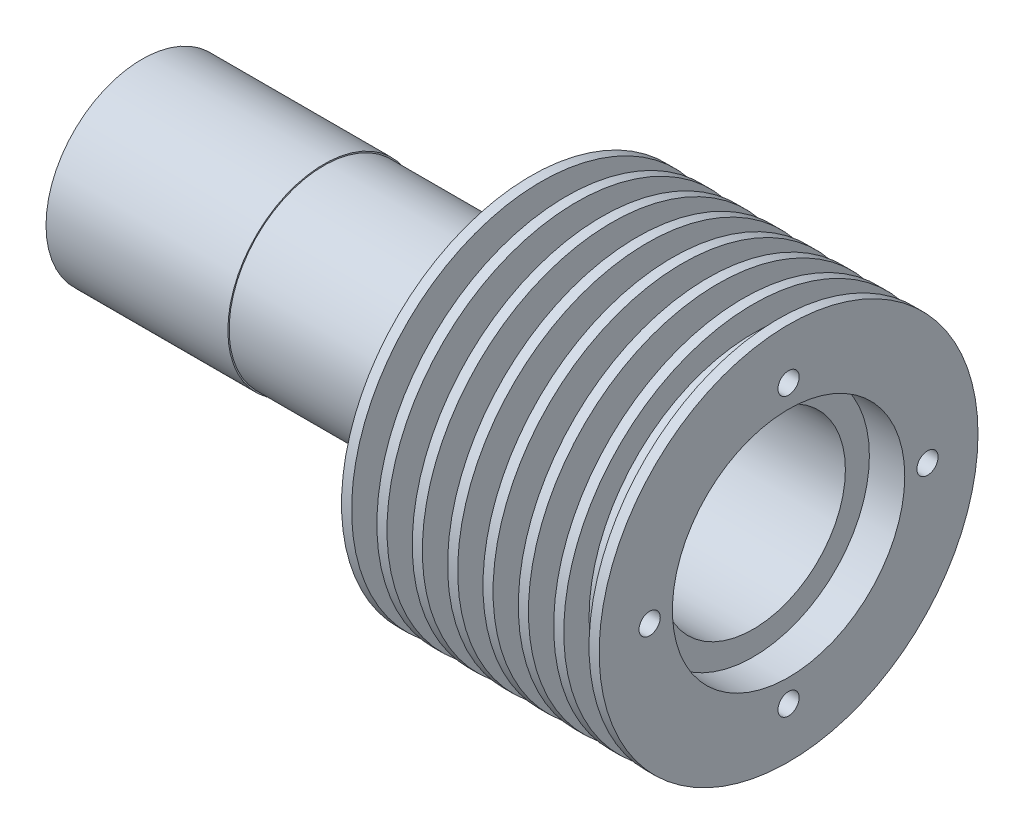
ISO-10303-21;
HEADER;
FILE_DESCRIPTION(('STEP AP214'),'2;1');
FILE_NAME('part.step','',(''),(''),'','','');
FILE_SCHEMA(('AUTOMOTIVE_DESIGN { 1 0 10303 214 1 1 1 1 }'));
ENDSEC;
DATA;
#1=APPLICATION_CONTEXT('core data for automotive mechanical design processes');
#2=APPLICATION_PROTOCOL_DEFINITION('international standard','automotive_design',2000,#1);
#3=PRODUCT_CONTEXT('',#1,'mechanical');
#4=PRODUCT('Part','Part','',(#3));
#5=PRODUCT_RELATED_PRODUCT_CATEGORY('part','',(#4));
#6=PRODUCT_DEFINITION_FORMATION('','',#4);
#7=PRODUCT_DEFINITION_CONTEXT('part definition',#1,'design');
#8=PRODUCT_DEFINITION('design','',#6,#7);
#9=PRODUCT_DEFINITION_SHAPE('','',#8);
#10=(LENGTH_UNIT() NAMED_UNIT(*) SI_UNIT(.MILLI.,.METRE.));
#11=(NAMED_UNIT(*) PLANE_ANGLE_UNIT() SI_UNIT($,.RADIAN.));
#12=(NAMED_UNIT(*) SI_UNIT($,.STERADIAN.) SOLID_ANGLE_UNIT());
#13=UNCERTAINTY_MEASURE_WITH_UNIT(LENGTH_MEASURE(1.E-05),#10,'distance_accuracy_value','');
#14=(GEOMETRIC_REPRESENTATION_CONTEXT(3) GLOBAL_UNCERTAINTY_ASSIGNED_CONTEXT((#13)) GLOBAL_UNIT_ASSIGNED_CONTEXT((#10,
#11,#12)) REPRESENTATION_CONTEXT('',''));
#15=CARTESIAN_POINT('',(0.,0.,0.));
#16=DIRECTION('',(0.,0.,1.));
#17=DIRECTION('',(1.,0.,0.));
#18=AXIS2_PLACEMENT_3D('',#15,#16,#17);
#19=CARTESIAN_POINT('',(0.,0.,0.));
#20=DIRECTION('',(-1.,0.,0.));
#21=DIRECTION('',(0.,0.,1.));
#22=AXIS2_PLACEMENT_3D('',#19,#20,#21);
#23=PLANE('',#22);
#24=CARTESIAN_POINT('',(0.,0.,27.5));
#25=DIRECTION('',(1.,0.,0.));
#26=DIRECTION('',(0.,0.,-1.));
#27=AXIS2_PLACEMENT_3D('',#24,#25,#26);
#28=CIRCLE('',#27,2.09999999999999);
#29=CARTESIAN_POINT('',(0.,0.,25.4));
#30=VERTEX_POINT('',#29);
#31=EDGE_CURVE('E171',#30,#30,#28,.T.);
#32=ORIENTED_EDGE('',*,*,#31,.F.);
#33=EDGE_LOOP('',(#32));
#34=FACE_BOUND('',#33,.T.);
#35=CARTESIAN_POINT('',(0.,0.,0.));
#36=DIRECTION('',(1.,0.,0.));
#37=DIRECTION('',(0.,0.,-1.));
#38=AXIS2_PLACEMENT_3D('',#35,#36,#37);
#39=CIRCLE('',#38,23.);
#40=CARTESIAN_POINT('',(0.,0.,-23.));
#41=VERTEX_POINT('',#40);
#42=EDGE_CURVE('E57',#41,#41,#39,.T.);
#43=ORIENTED_EDGE('',*,*,#42,.F.);
#44=EDGE_LOOP('',(#43));
#45=FACE_BOUND('',#44,.T.);
#46=CARTESIAN_POINT('',(0.,0.,0.));
#47=DIRECTION('',(1.,0.,0.));
#48=DIRECTION('',(0.,0.,-1.));
#49=AXIS2_PLACEMENT_3D('',#46,#47,#48);
#50=CIRCLE('',#49,37.5);
#51=CARTESIAN_POINT('',(0.,0.,-37.5));
#52=VERTEX_POINT('',#51);
#53=EDGE_CURVE('E60',#52,#52,#50,.T.);
#54=ORIENTED_EDGE('',*,*,#53,.T.);
#55=EDGE_LOOP('',(#54));
#56=FACE_BOUND('',#55,.T.);
#57=CARTESIAN_POINT('',(0.,0.,-27.5));
#58=DIRECTION('',(1.,0.,0.));
#59=DIRECTION('',(0.,0.,-1.));
#60=AXIS2_PLACEMENT_3D('',#57,#58,#59);
#61=CIRCLE('',#60,2.09999999999999);
#62=CARTESIAN_POINT('',(0.,0.,-29.6));
#63=VERTEX_POINT('',#62);
#64=EDGE_CURVE('E159',#63,#63,#61,.T.);
#65=ORIENTED_EDGE('',*,*,#64,.F.);
#66=EDGE_LOOP('',(#65));
#67=FACE_BOUND('',#66,.T.);
#68=CARTESIAN_POINT('',(0.,-27.5,0.));
#69=DIRECTION('',(1.,0.,0.));
#70=DIRECTION('',(0.,0.,-1.));
#71=AXIS2_PLACEMENT_3D('',#68,#69,#70);
#72=CIRCLE('',#71,2.09999999999999);
#73=CARTESIAN_POINT('',(0.,-27.5,-2.09999999999999));
#74=VERTEX_POINT('',#73);
#75=EDGE_CURVE('E165',#74,#74,#72,.T.);
#76=ORIENTED_EDGE('',*,*,#75,.F.);
#77=EDGE_LOOP('',(#76));
#78=FACE_BOUND('',#77,.T.);
#79=CARTESIAN_POINT('',(0.,27.5,0.));
#80=DIRECTION('',(1.,0.,0.));
#81=DIRECTION('',(0.,0.,-1.));
#82=AXIS2_PLACEMENT_3D('',#79,#80,#81);
#83=CIRCLE('',#82,2.09999999999999);
#84=CARTESIAN_POINT('',(0.,27.5,-2.09999999999999));
#85=VERTEX_POINT('',#84);
#86=EDGE_CURVE('E177',#85,#85,#83,.T.);
#87=ORIENTED_EDGE('',*,*,#86,.F.);
#88=EDGE_LOOP('',(#87));
#89=FACE_BOUND('',#88,.T.);
#90=ADVANCED_FACE('F34',(#34,#45,#56,#67,#78,#89),#23,.F.);
#91=CARTESIAN_POINT('',(-92.,0.,0.));
#92=DIRECTION('',(-1.,0.,0.));
#93=DIRECTION('',(0.,0.,1.));
#94=AXIS2_PLACEMENT_3D('',#91,#92,#93);
#95=PLANE('',#94);
#96=CARTESIAN_POINT('',(-92.,0.,0.));
#97=DIRECTION('',(1.,0.,0.));
#98=DIRECTION('',(0.,0.,-1.));
#99=AXIS2_PLACEMENT_3D('',#96,#97,#98);
#100=CIRCLE('',#99,18.75);
#101=CARTESIAN_POINT('',(-92.,0.,-18.75));
#102=VERTEX_POINT('',#101);
#103=EDGE_CURVE('E153',#102,#102,#100,.T.);
#104=ORIENTED_EDGE('',*,*,#103,.F.);
#105=EDGE_LOOP('',(#104));
#106=FACE_BOUND('',#105,.T.);
#107=CARTESIAN_POINT('',(-92.,0.,0.));
#108=DIRECTION('',(1.,0.,0.));
#109=DIRECTION('',(0.,0.,-1.));
#110=AXIS2_PLACEMENT_3D('',#107,#108,#109);
#111=CIRCLE('',#110,19.);
#112=CARTESIAN_POINT('',(-92.,0.,-19.));
#113=VERTEX_POINT('',#112);
#114=EDGE_CURVE('E10',#113,#113,#111,.T.);
#115=ORIENTED_EDGE('',*,*,#114,.T.);
#116=EDGE_LOOP('',(#115));
#117=FACE_BOUND('',#116,.T.);
#118=ADVANCED_FACE('F36',(#106,#117),#95,.F.);
#119=CARTESIAN_POINT('',(0.,0.,0.));
#120=DIRECTION('',(1.,0.,0.));
#121=DIRECTION('',(0.,0.,-1.));
#122=AXIS2_PLACEMENT_3D('',#119,#120,#121);
#123=CYLINDRICAL_SURFACE('',#122,19.);
#124=ORIENTED_EDGE('',*,*,#114,.F.);
#125=EDGE_LOOP('',(#124));
#126=FACE_BOUND('',#125,.T.);
#127=CARTESIAN_POINT('',(-128.,0.,0.));
#128=DIRECTION('',(1.,0.,0.));
#129=DIRECTION('',(0.,0.,-1.));
#130=AXIS2_PLACEMENT_3D('',#127,#128,#129);
#131=CIRCLE('',#130,19.);
#132=CARTESIAN_POINT('',(-128.,0.,-19.));
#133=VERTEX_POINT('',#132);
#134=EDGE_CURVE('E41',#133,#133,#131,.T.);
#135=ORIENTED_EDGE('',*,*,#134,.T.);
#136=EDGE_LOOP('',(#135));
#137=FACE_BOUND('',#136,.T.);
#138=ADVANCED_FACE('F189',(#126,#137),#123,.T.);
#139=CARTESIAN_POINT('',(-128.,0.,0.));
#140=DIRECTION('',(1.,0.,0.));
#141=DIRECTION('',(0.,0.,-1.));
#142=AXIS2_PLACEMENT_3D('',#139,#140,#141);
#143=PLANE('',#142);
#144=ORIENTED_EDGE('',*,*,#134,.F.);
#145=EDGE_LOOP('',(#144));
#146=FACE_BOUND('',#145,.T.);
#147=CARTESIAN_POINT('',(-128.,0.,0.));
#148=DIRECTION('',(1.,0.,0.));
#149=DIRECTION('',(0.,0.,-1.));
#150=AXIS2_PLACEMENT_3D('',#147,#148,#149);
#151=CIRCLE('',#150,18.25);
#152=CARTESIAN_POINT('',(-128.,0.,-18.25));
#153=VERTEX_POINT('',#152);
#154=EDGE_CURVE('E45',#153,#153,#151,.T.);
#155=ORIENTED_EDGE('',*,*,#154,.T.);
#156=EDGE_LOOP('',(#155));
#157=FACE_BOUND('',#156,.T.);
#158=ADVANCED_FACE('F208',(#146,#157),#143,.F.);
#159=CARTESIAN_POINT('',(0.,0.,0.));
#160=DIRECTION('',(1.,0.,0.));
#161=DIRECTION('',(0.,0.,-1.));
#162=AXIS2_PLACEMENT_3D('',#159,#160,#161);
#163=CYLINDRICAL_SURFACE('',#162,18.25);
#164=CARTESIAN_POINT('',(-6.99999999999999,0.,0.));
#165=DIRECTION('',(1.,0.,0.));
#166=DIRECTION('',(0.,0.,-1.));
#167=AXIS2_PLACEMENT_3D('',#164,#165,#166);
#168=CIRCLE('',#167,18.25);
#169=CARTESIAN_POINT('',(-6.99999999999999,0.,-18.25));
#170=VERTEX_POINT('',#169);
#171=EDGE_CURVE('E49',#170,#170,#168,.T.);
#172=ORIENTED_EDGE('',*,*,#171,.T.);
#173=EDGE_LOOP('',(#172));
#174=FACE_BOUND('',#173,.T.);
#175=ORIENTED_EDGE('',*,*,#154,.F.);
#176=EDGE_LOOP('',(#175));
#177=FACE_BOUND('',#176,.T.);
#178=ADVANCED_FACE('F204',(#174,#177),#163,.F.);
#179=CARTESIAN_POINT('',(-7.,0.,0.));
#180=DIRECTION('',(-1.,0.,0.));
#181=DIRECTION('',(0.,0.,1.));
#182=AXIS2_PLACEMENT_3D('',#179,#180,#181);
#183=PLANE('',#182);
#184=ORIENTED_EDGE('',*,*,#171,.F.);
#185=EDGE_LOOP('',(#184));
#186=FACE_BOUND('',#185,.T.);
#187=CARTESIAN_POINT('',(-7.,0.,0.));
#188=DIRECTION('',(1.,0.,0.));
#189=DIRECTION('',(0.,0.,-1.));
#190=AXIS2_PLACEMENT_3D('',#187,#188,#189);
#191=CIRCLE('',#190,23.);
#192=CARTESIAN_POINT('',(-7.,0.,-23.));
#193=VERTEX_POINT('',#192);
#194=EDGE_CURVE('E54',#193,#193,#191,.T.);
#195=ORIENTED_EDGE('',*,*,#194,.T.);
#196=EDGE_LOOP('',(#195));
#197=FACE_BOUND('',#196,.T.);
#198=ADVANCED_FACE('F200',(#186,#197),#183,.F.);
#199=CARTESIAN_POINT('',(0.,0.,0.));
#200=DIRECTION('',(1.,0.,0.));
#201=DIRECTION('',(0.,0.,-1.));
#202=AXIS2_PLACEMENT_3D('',#199,#200,#201);
#203=CYLINDRICAL_SURFACE('',#202,23.);
#204=ORIENTED_EDGE('',*,*,#194,.F.);
#205=EDGE_LOOP('',(#204));
#206=FACE_BOUND('',#205,.T.);
#207=ORIENTED_EDGE('',*,*,#42,.T.);
#208=EDGE_LOOP('',(#207));
#209=FACE_BOUND('',#208,.T.);
#210=ADVANCED_FACE('F197',(#206,#209),#203,.F.);
#211=CARTESIAN_POINT('',(0.,0.,0.));
#212=DIRECTION('',(1.,0.,0.));
#213=DIRECTION('',(0.,0.,-1.));
#214=AXIS2_PLACEMENT_3D('',#211,#212,#213);
#215=CYLINDRICAL_SURFACE('',#214,37.5);
#216=ORIENTED_EDGE('',*,*,#53,.F.);
#217=EDGE_LOOP('',(#216));
#218=FACE_BOUND('',#217,.T.);
#219=CARTESIAN_POINT('',(-2.,0.,0.));
#220=DIRECTION('',(1.,0.,0.));
#221=DIRECTION('',(0.,0.,-1.));
#222=AXIS2_PLACEMENT_3D('',#219,#220,#221);
#223=CIRCLE('',#222,37.5);
#224=CARTESIAN_POINT('',(-2.,0.,-37.5));
#225=VERTEX_POINT('',#224);
#226=EDGE_CURVE('E63',#225,#225,#223,.T.);
#227=ORIENTED_EDGE('',*,*,#226,.T.);
#228=EDGE_LOOP('',(#227));
#229=FACE_BOUND('',#228,.T.);
#230=ADVANCED_FACE('F195',(#218,#229),#215,.T.);
#231=CARTESIAN_POINT('',(-2.,0.,0.));
#232=DIRECTION('',(1.,0.,0.));
#233=DIRECTION('',(0.,0.,-1.));
#234=AXIS2_PLACEMENT_3D('',#231,#232,#233);
#235=PLANE('',#234);
#236=ORIENTED_EDGE('',*,*,#226,.F.);
#237=EDGE_LOOP('',(#236));
#238=FACE_BOUND('',#237,.T.);
#239=CARTESIAN_POINT('',(-2.,0.,0.));
#240=DIRECTION('',(1.,0.,0.));
#241=DIRECTION('',(0.,0.,-1.));
#242=AXIS2_PLACEMENT_3D('',#239,#240,#241);
#243=CIRCLE('',#242,32.5);
#244=CARTESIAN_POINT('',(-2.,0.,-32.5));
#245=VERTEX_POINT('',#244);
#246=EDGE_CURVE('E66',#245,#245,#243,.T.);
#247=ORIENTED_EDGE('',*,*,#246,.T.);
#248=EDGE_LOOP('',(#247));
#249=FACE_BOUND('',#248,.T.);
#250=ADVANCED_FACE('F243',(#238,#249),#235,.F.);
#251=CARTESIAN_POINT('',(0.,0.,0.));
#252=DIRECTION('',(1.,0.,0.));
#253=DIRECTION('',(0.,0.,-1.));
#254=AXIS2_PLACEMENT_3D('',#251,#252,#253);
#255=CYLINDRICAL_SURFACE('',#254,32.5);
#256=ORIENTED_EDGE('',*,*,#246,.F.);
#257=EDGE_LOOP('',(#256));
#258=FACE_BOUND('',#257,.T.);
#259=CARTESIAN_POINT('',(-7.,0.,0.));
#260=DIRECTION('',(1.,0.,0.));
#261=DIRECTION('',(0.,0.,-1.));
#262=AXIS2_PLACEMENT_3D('',#259,#260,#261);
#263=CIRCLE('',#262,32.5);
#264=CARTESIAN_POINT('',(-7.,0.,-32.5));
#265=VERTEX_POINT('',#264);
#266=EDGE_CURVE('E69',#265,#265,#263,.T.);
#267=ORIENTED_EDGE('',*,*,#266,.T.);
#268=EDGE_LOOP('',(#267));
#269=FACE_BOUND('',#268,.T.);
#270=ADVANCED_FACE('F249',(#258,#269),#255,.T.);
#271=CARTESIAN_POINT('',(-7.,0.,0.));
#272=DIRECTION('',(-1.,0.,0.));
#273=DIRECTION('',(0.,0.,1.));
#274=AXIS2_PLACEMENT_3D('',#271,#272,#273);
#275=PLANE('',#274);
#276=ORIENTED_EDGE('',*,*,#266,.F.);
#277=EDGE_LOOP('',(#276));
#278=FACE_BOUND('',#277,.T.);
#279=CARTESIAN_POINT('',(-7.,0.,0.));
#280=DIRECTION('',(1.,0.,0.));
#281=DIRECTION('',(0.,0.,-1.));
#282=AXIS2_PLACEMENT_3D('',#279,#280,#281);
#283=CIRCLE('',#282,37.5);
#284=CARTESIAN_POINT('',(-7.,0.,-37.5));
#285=VERTEX_POINT('',#284);
#286=EDGE_CURVE('E72',#285,#285,#283,.T.);
#287=ORIENTED_EDGE('',*,*,#286,.T.);
#288=EDGE_LOOP('',(#287));
#289=FACE_BOUND('',#288,.T.);
#290=ADVANCED_FACE('F256',(#278,#289),#275,.F.);
#291=CARTESIAN_POINT('',(0.,0.,0.));
#292=DIRECTION('',(1.,0.,0.));
#293=DIRECTION('',(0.,0.,-1.));
#294=AXIS2_PLACEMENT_3D('',#291,#292,#293);
#295=CYLINDRICAL_SURFACE('',#294,37.5);
#296=ORIENTED_EDGE('',*,*,#286,.F.);
#297=EDGE_LOOP('',(#296));
#298=FACE_BOUND('',#297,.T.);
#299=CARTESIAN_POINT('',(-9.,0.,0.));
#300=DIRECTION('',(1.,0.,0.));
#301=DIRECTION('',(0.,0.,-1.));
#302=AXIS2_PLACEMENT_3D('',#299,#300,#301);
#303=CIRCLE('',#302,37.5);
#304=CARTESIAN_POINT('',(-9.,0.,-37.5));
#305=VERTEX_POINT('',#304);
#306=EDGE_CURVE('E75',#305,#305,#303,.T.);
#307=ORIENTED_EDGE('',*,*,#306,.T.);
#308=EDGE_LOOP('',(#307));
#309=FACE_BOUND('',#308,.T.);
#310=ADVANCED_FACE('F264',(#298,#309),#295,.T.);
#311=CARTESIAN_POINT('',(-9.,0.,0.));
#312=DIRECTION('',(1.,0.,0.));
#313=DIRECTION('',(0.,0.,-1.));
#314=AXIS2_PLACEMENT_3D('',#311,#312,#313);
#315=PLANE('',#314);
#316=CARTESIAN_POINT('',(-9.,27.5,0.));
#317=DIRECTION('',(1.,0.,0.));
#318=DIRECTION('',(0.,0.,-1.));
#319=AXIS2_PLACEMENT_3D('',#316,#317,#318);
#320=CIRCLE('',#319,2.09999999999999);
#321=CARTESIAN_POINT('',(-9.,27.5,-2.09999999999999));
#322=VERTEX_POINT('',#321);
#323=EDGE_CURVE('E174',#322,#322,#320,.T.);
#324=ORIENTED_EDGE('',*,*,#323,.T.);
#325=EDGE_LOOP('',(#324));
#326=FACE_BOUND('',#325,.T.);
#327=CARTESIAN_POINT('',(-9.,0.,27.5));
#328=DIRECTION('',(1.,0.,0.));
#329=DIRECTION('',(0.,0.,-1.));
#330=AXIS2_PLACEMENT_3D('',#327,#328,#329);
#331=CIRCLE('',#330,2.09999999999999);
#332=CARTESIAN_POINT('',(-9.,0.,25.4));
#333=VERTEX_POINT('',#332);
#334=EDGE_CURVE('E168',#333,#333,#331,.T.);
#335=ORIENTED_EDGE('',*,*,#334,.T.);
#336=EDGE_LOOP('',(#335));
#337=FACE_BOUND('',#336,.T.);
#338=CARTESIAN_POINT('',(-9.,-27.5,0.));
#339=DIRECTION('',(1.,0.,0.));
#340=DIRECTION('',(0.,0.,-1.));
#341=AXIS2_PLACEMENT_3D('',#338,#339,#340);
#342=CIRCLE('',#341,2.09999999999999);
#343=CARTESIAN_POINT('',(-9.,-27.5,-2.09999999999999));
#344=VERTEX_POINT('',#343);
#345=EDGE_CURVE('E162',#344,#344,#342,.T.);
#346=ORIENTED_EDGE('',*,*,#345,.T.);
#347=EDGE_LOOP('',(#346));
#348=FACE_BOUND('',#347,.T.);
#349=CARTESIAN_POINT('',(-9.,0.,-27.5));
#350=DIRECTION('',(1.,0.,0.));
#351=DIRECTION('',(0.,0.,-1.));
#352=AXIS2_PLACEMENT_3D('',#349,#350,#351);
#353=CIRCLE('',#352,2.09999999999999);
#354=CARTESIAN_POINT('',(-9.,0.,-29.6));
#355=VERTEX_POINT('',#354);
#356=EDGE_CURVE('E156',#355,#355,#353,.T.);
#357=ORIENTED_EDGE('',*,*,#356,.T.);
#358=EDGE_LOOP('',(#357));
#359=FACE_BOUND('',#358,.T.);
#360=ORIENTED_EDGE('',*,*,#306,.F.);
#361=EDGE_LOOP('',(#360));
#362=FACE_BOUND('',#361,.T.);
#363=CARTESIAN_POINT('',(-9.,0.,0.));
#364=DIRECTION('',(1.,0.,0.));
#365=DIRECTION('',(0.,0.,-1.));
#366=AXIS2_PLACEMENT_3D('',#363,#364,#365);
#367=CIRCLE('',#366,18.75);
#368=CARTESIAN_POINT('',(-9.,0.,-18.75));
#369=VERTEX_POINT('',#368);
#370=EDGE_CURVE('E78',#369,#369,#367,.T.);
#371=ORIENTED_EDGE('',*,*,#370,.T.);
#372=EDGE_LOOP('',(#371));
#373=FACE_BOUND('',#372,.T.);
#374=ADVANCED_FACE('F272',(#326,#337,#348,#359,#362,#373),#315,.F.);
#375=CARTESIAN_POINT('',(0.,0.,0.));
#376=DIRECTION('',(1.,0.,0.));
#377=DIRECTION('',(0.,0.,-1.));
#378=AXIS2_PLACEMENT_3D('',#375,#376,#377);
#379=CYLINDRICAL_SURFACE('',#378,18.75);
#380=ORIENTED_EDGE('',*,*,#370,.F.);
#381=EDGE_LOOP('',(#380));
#382=FACE_BOUND('',#381,.T.);
#383=CARTESIAN_POINT('',(-14.,0.,0.));
#384=DIRECTION('',(1.,0.,0.));
#385=DIRECTION('',(0.,0.,-1.));
#386=AXIS2_PLACEMENT_3D('',#383,#384,#385);
#387=CIRCLE('',#386,18.75);
#388=CARTESIAN_POINT('',(-14.,0.,-18.75));
#389=VERTEX_POINT('',#388);
#390=EDGE_CURVE('E81',#389,#389,#387,.T.);
#391=ORIENTED_EDGE('',*,*,#390,.T.);
#392=EDGE_LOOP('',(#391));
#393=FACE_BOUND('',#392,.T.);
#394=ADVANCED_FACE('F281',(#382,#393),#379,.T.);
#395=CARTESIAN_POINT('',(-14.,0.,0.));
#396=DIRECTION('',(-1.,0.,0.));
#397=DIRECTION('',(0.,0.,1.));
#398=AXIS2_PLACEMENT_3D('',#395,#396,#397);
#399=PLANE('',#398);
#400=ORIENTED_EDGE('',*,*,#390,.F.);
#401=EDGE_LOOP('',(#400));
#402=FACE_BOUND('',#401,.T.);
#403=CARTESIAN_POINT('',(-14.,0.,0.));
#404=DIRECTION('',(1.,0.,0.));
#405=DIRECTION('',(0.,0.,-1.));
#406=AXIS2_PLACEMENT_3D('',#403,#404,#405);
#407=CIRCLE('',#406,37.5);
#408=CARTESIAN_POINT('',(-14.,0.,-37.5));
#409=VERTEX_POINT('',#408);
#410=EDGE_CURVE('E84',#409,#409,#407,.T.);
#411=ORIENTED_EDGE('',*,*,#410,.T.);
#412=EDGE_LOOP('',(#411));
#413=FACE_BOUND('',#412,.T.);
#414=ADVANCED_FACE('F290',(#402,#413),#399,.F.);
#415=CARTESIAN_POINT('',(0.,0.,0.));
#416=DIRECTION('',(1.,0.,0.));
#417=DIRECTION('',(0.,0.,-1.));
#418=AXIS2_PLACEMENT_3D('',#415,#416,#417);
#419=CYLINDRICAL_SURFACE('',#418,37.5);
#420=ORIENTED_EDGE('',*,*,#410,.F.);
#421=EDGE_LOOP('',(#420));
#422=FACE_BOUND('',#421,.T.);
#423=CARTESIAN_POINT('',(-16.,0.,0.));
#424=DIRECTION('',(1.,0.,0.));
#425=DIRECTION('',(0.,0.,-1.));
#426=AXIS2_PLACEMENT_3D('',#423,#424,#425);
#427=CIRCLE('',#426,37.5);
#428=CARTESIAN_POINT('',(-16.,0.,-37.5));
#429=VERTEX_POINT('',#428);
#430=EDGE_CURVE('E87',#429,#429,#427,.T.);
#431=ORIENTED_EDGE('',*,*,#430,.T.);
#432=EDGE_LOOP('',(#431));
#433=FACE_BOUND('',#432,.T.);
#434=ADVANCED_FACE('F299',(#422,#433),#419,.T.);
#435=CARTESIAN_POINT('',(-16.,0.,0.));
#436=DIRECTION('',(1.,0.,0.));
#437=DIRECTION('',(0.,0.,-1.));
#438=AXIS2_PLACEMENT_3D('',#435,#436,#437);
#439=PLANE('',#438);
#440=ORIENTED_EDGE('',*,*,#430,.F.);
#441=EDGE_LOOP('',(#440));
#442=FACE_BOUND('',#441,.T.);
#443=CARTESIAN_POINT('',(-16.,0.,0.));
#444=DIRECTION('',(1.,0.,0.));
#445=DIRECTION('',(0.,0.,-1.));
#446=AXIS2_PLACEMENT_3D('',#443,#444,#445);
#447=CIRCLE('',#446,18.75);
#448=CARTESIAN_POINT('',(-16.,0.,-18.75));
#449=VERTEX_POINT('',#448);
#450=EDGE_CURVE('E90',#449,#449,#447,.T.);
#451=ORIENTED_EDGE('',*,*,#450,.T.);
#452=EDGE_LOOP('',(#451));
#453=FACE_BOUND('',#452,.T.);
#454=ADVANCED_FACE('F308',(#442,#453),#439,.F.);
#455=CARTESIAN_POINT('',(0.,0.,0.));
#456=DIRECTION('',(1.,0.,0.));
#457=DIRECTION('',(0.,0.,-1.));
#458=AXIS2_PLACEMENT_3D('',#455,#456,#457);
#459=CYLINDRICAL_SURFACE('',#458,18.75);
#460=ORIENTED_EDGE('',*,*,#450,.F.);
#461=EDGE_LOOP('',(#460));
#462=FACE_BOUND('',#461,.T.);
#463=CARTESIAN_POINT('',(-21.,0.,0.));
#464=DIRECTION('',(1.,0.,0.));
#465=DIRECTION('',(0.,0.,-1.));
#466=AXIS2_PLACEMENT_3D('',#463,#464,#465);
#467=CIRCLE('',#466,18.75);
#468=CARTESIAN_POINT('',(-21.,0.,-18.75));
#469=VERTEX_POINT('',#468);
#470=EDGE_CURVE('E93',#469,#469,#467,.T.);
#471=ORIENTED_EDGE('',*,*,#470,.T.);
#472=EDGE_LOOP('',(#471));
#473=FACE_BOUND('',#472,.T.);
#474=ADVANCED_FACE('F315',(#462,#473),#459,.T.);
#475=CARTESIAN_POINT('',(-21.,0.,0.));
#476=DIRECTION('',(-1.,0.,0.));
#477=DIRECTION('',(0.,0.,1.));
#478=AXIS2_PLACEMENT_3D('',#475,#476,#477);
#479=PLANE('',#478);
#480=ORIENTED_EDGE('',*,*,#470,.F.);
#481=EDGE_LOOP('',(#480));
#482=FACE_BOUND('',#481,.T.);
#483=CARTESIAN_POINT('',(-21.,0.,0.));
#484=DIRECTION('',(1.,0.,0.));
#485=DIRECTION('',(0.,0.,-1.));
#486=AXIS2_PLACEMENT_3D('',#483,#484,#485);
#487=CIRCLE('',#486,37.5);
#488=CARTESIAN_POINT('',(-21.,0.,-37.5));
#489=VERTEX_POINT('',#488);
#490=EDGE_CURVE('E96',#489,#489,#487,.T.);
#491=ORIENTED_EDGE('',*,*,#490,.T.);
#492=EDGE_LOOP('',(#491));
#493=FACE_BOUND('',#492,.T.);
#494=ADVANCED_FACE('F324',(#482,#493),#479,.F.);
#495=CARTESIAN_POINT('',(0.,0.,0.));
#496=DIRECTION('',(1.,0.,0.));
#497=DIRECTION('',(0.,0.,-1.));
#498=AXIS2_PLACEMENT_3D('',#495,#496,#497);
#499=CYLINDRICAL_SURFACE('',#498,37.5);
#500=ORIENTED_EDGE('',*,*,#490,.F.);
#501=EDGE_LOOP('',(#500));
#502=FACE_BOUND('',#501,.T.);
#503=CARTESIAN_POINT('',(-23.,0.,0.));
#504=DIRECTION('',(1.,0.,0.));
#505=DIRECTION('',(0.,0.,-1.));
#506=AXIS2_PLACEMENT_3D('',#503,#504,#505);
#507=CIRCLE('',#506,37.5);
#508=CARTESIAN_POINT('',(-23.,0.,-37.5));
#509=VERTEX_POINT('',#508);
#510=EDGE_CURVE('E99',#509,#509,#507,.T.);
#511=ORIENTED_EDGE('',*,*,#510,.T.);
#512=EDGE_LOOP('',(#511));
#513=FACE_BOUND('',#512,.T.);
#514=ADVANCED_FACE('F333',(#502,#513),#499,.T.);
#515=CARTESIAN_POINT('',(-23.,0.,0.));
#516=DIRECTION('',(1.,0.,0.));
#517=DIRECTION('',(0.,0.,-1.));
#518=AXIS2_PLACEMENT_3D('',#515,#516,#517);
#519=PLANE('',#518);
#520=ORIENTED_EDGE('',*,*,#510,.F.);
#521=EDGE_LOOP('',(#520));
#522=FACE_BOUND('',#521,.T.);
#523=CARTESIAN_POINT('',(-23.,0.,0.));
#524=DIRECTION('',(1.,0.,0.));
#525=DIRECTION('',(0.,0.,-1.));
#526=AXIS2_PLACEMENT_3D('',#523,#524,#525);
#527=CIRCLE('',#526,18.75);
#528=CARTESIAN_POINT('',(-23.,0.,-18.75));
#529=VERTEX_POINT('',#528);
#530=EDGE_CURVE('E102',#529,#529,#527,.T.);
#531=ORIENTED_EDGE('',*,*,#530,.T.);
#532=EDGE_LOOP('',(#531));
#533=FACE_BOUND('',#532,.T.);
#534=ADVANCED_FACE('F342',(#522,#533),#519,.F.);
#535=CARTESIAN_POINT('',(0.,0.,0.));
#536=DIRECTION('',(1.,0.,0.));
#537=DIRECTION('',(0.,0.,-1.));
#538=AXIS2_PLACEMENT_3D('',#535,#536,#537);
#539=CYLINDRICAL_SURFACE('',#538,18.75);
#540=ORIENTED_EDGE('',*,*,#530,.F.);
#541=EDGE_LOOP('',(#540));
#542=FACE_BOUND('',#541,.T.);
#543=CARTESIAN_POINT('',(-28.,0.,0.));
#544=DIRECTION('',(1.,0.,0.));
#545=DIRECTION('',(0.,0.,-1.));
#546=AXIS2_PLACEMENT_3D('',#543,#544,#545);
#547=CIRCLE('',#546,18.75);
#548=CARTESIAN_POINT('',(-28.,0.,-18.75));
#549=VERTEX_POINT('',#548);
#550=EDGE_CURVE('E105',#549,#549,#547,.T.);
#551=ORIENTED_EDGE('',*,*,#550,.T.);
#552=EDGE_LOOP('',(#551));
#553=FACE_BOUND('',#552,.T.);
#554=ADVANCED_FACE('F351',(#542,#553),#539,.T.);
#555=CARTESIAN_POINT('',(-28.,0.,0.));
#556=DIRECTION('',(-1.,0.,0.));
#557=DIRECTION('',(0.,0.,1.));
#558=AXIS2_PLACEMENT_3D('',#555,#556,#557);
#559=PLANE('',#558);
#560=ORIENTED_EDGE('',*,*,#550,.F.);
#561=EDGE_LOOP('',(#560));
#562=FACE_BOUND('',#561,.T.);
#563=CARTESIAN_POINT('',(-28.,0.,0.));
#564=DIRECTION('',(1.,0.,0.));
#565=DIRECTION('',(0.,0.,-1.));
#566=AXIS2_PLACEMENT_3D('',#563,#564,#565);
#567=CIRCLE('',#566,37.5);
#568=CARTESIAN_POINT('',(-28.,0.,-37.5));
#569=VERTEX_POINT('',#568);
#570=EDGE_CURVE('E108',#569,#569,#567,.T.);
#571=ORIENTED_EDGE('',*,*,#570,.T.);
#572=EDGE_LOOP('',(#571));
#573=FACE_BOUND('',#572,.T.);
#574=ADVANCED_FACE('F359',(#562,#573),#559,.F.);
#575=CARTESIAN_POINT('',(0.,0.,0.));
#576=DIRECTION('',(1.,0.,0.));
#577=DIRECTION('',(0.,0.,-1.));
#578=AXIS2_PLACEMENT_3D('',#575,#576,#577);
#579=CYLINDRICAL_SURFACE('',#578,37.5);
#580=ORIENTED_EDGE('',*,*,#570,.F.);
#581=EDGE_LOOP('',(#580));
#582=FACE_BOUND('',#581,.T.);
#583=CARTESIAN_POINT('',(-30.,0.,0.));
#584=DIRECTION('',(1.,0.,0.));
#585=DIRECTION('',(0.,0.,-1.));
#586=AXIS2_PLACEMENT_3D('',#583,#584,#585);
#587=CIRCLE('',#586,37.5);
#588=CARTESIAN_POINT('',(-30.,0.,-37.5));
#589=VERTEX_POINT('',#588);
#590=EDGE_CURVE('E111',#589,#589,#587,.T.);
#591=ORIENTED_EDGE('',*,*,#590,.T.);
#592=EDGE_LOOP('',(#591));
#593=FACE_BOUND('',#592,.T.);
#594=ADVANCED_FACE('F367',(#582,#593),#579,.T.);
#595=CARTESIAN_POINT('',(-30.,0.,0.));
#596=DIRECTION('',(1.,0.,0.));
#597=DIRECTION('',(0.,0.,-1.));
#598=AXIS2_PLACEMENT_3D('',#595,#596,#597);
#599=PLANE('',#598);
#600=ORIENTED_EDGE('',*,*,#590,.F.);
#601=EDGE_LOOP('',(#600));
#602=FACE_BOUND('',#601,.T.);
#603=CARTESIAN_POINT('',(-30.,0.,0.));
#604=DIRECTION('',(1.,0.,0.));
#605=DIRECTION('',(0.,0.,-1.));
#606=AXIS2_PLACEMENT_3D('',#603,#604,#605);
#607=CIRCLE('',#606,18.75);
#608=CARTESIAN_POINT('',(-30.,0.,-18.75));
#609=VERTEX_POINT('',#608);
#610=EDGE_CURVE('E114',#609,#609,#607,.T.);
#611=ORIENTED_EDGE('',*,*,#610,.T.);
#612=EDGE_LOOP('',(#611));
#613=FACE_BOUND('',#612,.T.);
#614=ADVANCED_FACE('F375',(#602,#613),#599,.F.);
#615=CARTESIAN_POINT('',(0.,0.,0.));
#616=DIRECTION('',(1.,0.,0.));
#617=DIRECTION('',(0.,0.,-1.));
#618=AXIS2_PLACEMENT_3D('',#615,#616,#617);
#619=CYLINDRICAL_SURFACE('',#618,18.75);
#620=ORIENTED_EDGE('',*,*,#610,.F.);
#621=EDGE_LOOP('',(#620));
#622=FACE_BOUND('',#621,.T.);
#623=CARTESIAN_POINT('',(-35.,0.,0.));
#624=DIRECTION('',(1.,0.,0.));
#625=DIRECTION('',(0.,0.,-1.));
#626=AXIS2_PLACEMENT_3D('',#623,#624,#625);
#627=CIRCLE('',#626,18.75);
#628=CARTESIAN_POINT('',(-35.,0.,-18.75));
#629=VERTEX_POINT('',#628);
#630=EDGE_CURVE('E117',#629,#629,#627,.T.);
#631=ORIENTED_EDGE('',*,*,#630,.T.);
#632=EDGE_LOOP('',(#631));
#633=FACE_BOUND('',#632,.T.);
#634=ADVANCED_FACE('F383',(#622,#633),#619,.T.);
#635=CARTESIAN_POINT('',(-35.,0.,0.));
#636=DIRECTION('',(-1.,0.,0.));
#637=DIRECTION('',(0.,0.,1.));
#638=AXIS2_PLACEMENT_3D('',#635,#636,#637);
#639=PLANE('',#638);
#640=ORIENTED_EDGE('',*,*,#630,.F.);
#641=EDGE_LOOP('',(#640));
#642=FACE_BOUND('',#641,.T.);
#643=CARTESIAN_POINT('',(-35.,0.,0.));
#644=DIRECTION('',(1.,0.,0.));
#645=DIRECTION('',(0.,0.,-1.));
#646=AXIS2_PLACEMENT_3D('',#643,#644,#645);
#647=CIRCLE('',#646,37.5);
#648=CARTESIAN_POINT('',(-35.,0.,-37.5));
#649=VERTEX_POINT('',#648);
#650=EDGE_CURVE('E120',#649,#649,#647,.T.);
#651=ORIENTED_EDGE('',*,*,#650,.T.);
#652=EDGE_LOOP('',(#651));
#653=FACE_BOUND('',#652,.T.);
#654=ADVANCED_FACE('F391',(#642,#653),#639,.F.);
#655=CARTESIAN_POINT('',(0.,0.,0.));
#656=DIRECTION('',(1.,0.,0.));
#657=DIRECTION('',(0.,0.,-1.));
#658=AXIS2_PLACEMENT_3D('',#655,#656,#657);
#659=CYLINDRICAL_SURFACE('',#658,37.5);
#660=ORIENTED_EDGE('',*,*,#650,.F.);
#661=EDGE_LOOP('',(#660));
#662=FACE_BOUND('',#661,.T.);
#663=CARTESIAN_POINT('',(-37.,0.,0.));
#664=DIRECTION('',(1.,0.,0.));
#665=DIRECTION('',(0.,0.,-1.));
#666=AXIS2_PLACEMENT_3D('',#663,#664,#665);
#667=CIRCLE('',#666,37.5);
#668=CARTESIAN_POINT('',(-37.,0.,-37.5));
#669=VERTEX_POINT('',#668);
#670=EDGE_CURVE('E123',#669,#669,#667,.T.);
#671=ORIENTED_EDGE('',*,*,#670,.T.);
#672=EDGE_LOOP('',(#671));
#673=FACE_BOUND('',#672,.T.);
#674=ADVANCED_FACE('F399',(#662,#673),#659,.T.);
#675=CARTESIAN_POINT('',(-37.,0.,0.));
#676=DIRECTION('',(1.,0.,0.));
#677=DIRECTION('',(0.,0.,-1.));
#678=AXIS2_PLACEMENT_3D('',#675,#676,#677);
#679=PLANE('',#678);
#680=ORIENTED_EDGE('',*,*,#670,.F.);
#681=EDGE_LOOP('',(#680));
#682=FACE_BOUND('',#681,.T.);
#683=CARTESIAN_POINT('',(-37.,0.,0.));
#684=DIRECTION('',(1.,0.,0.));
#685=DIRECTION('',(0.,0.,-1.));
#686=AXIS2_PLACEMENT_3D('',#683,#684,#685);
#687=CIRCLE('',#686,18.75);
#688=CARTESIAN_POINT('',(-37.,0.,-18.75));
#689=VERTEX_POINT('',#688);
#690=EDGE_CURVE('E126',#689,#689,#687,.T.);
#691=ORIENTED_EDGE('',*,*,#690,.T.);
#692=EDGE_LOOP('',(#691));
#693=FACE_BOUND('',#692,.T.);
#694=ADVANCED_FACE('F407',(#682,#693),#679,.F.);
#695=CARTESIAN_POINT('',(0.,0.,0.));
#696=DIRECTION('',(1.,0.,0.));
#697=DIRECTION('',(0.,0.,-1.));
#698=AXIS2_PLACEMENT_3D('',#695,#696,#697);
#699=CYLINDRICAL_SURFACE('',#698,18.75);
#700=ORIENTED_EDGE('',*,*,#690,.F.);
#701=EDGE_LOOP('',(#700));
#702=FACE_BOUND('',#701,.T.);
#703=CARTESIAN_POINT('',(-42.,0.,0.));
#704=DIRECTION('',(1.,0.,0.));
#705=DIRECTION('',(0.,0.,-1.));
#706=AXIS2_PLACEMENT_3D('',#703,#704,#705);
#707=CIRCLE('',#706,18.75);
#708=CARTESIAN_POINT('',(-42.,0.,-18.75));
#709=VERTEX_POINT('',#708);
#710=EDGE_CURVE('E129',#709,#709,#707,.T.);
#711=ORIENTED_EDGE('',*,*,#710,.T.);
#712=EDGE_LOOP('',(#711));
#713=FACE_BOUND('',#712,.T.);
#714=ADVANCED_FACE('F414',(#702,#713),#699,.T.);
#715=CARTESIAN_POINT('',(-42.,0.,0.));
#716=DIRECTION('',(-1.,0.,0.));
#717=DIRECTION('',(0.,0.,1.));
#718=AXIS2_PLACEMENT_3D('',#715,#716,#717);
#719=PLANE('',#718);
#720=ORIENTED_EDGE('',*,*,#710,.F.);
#721=EDGE_LOOP('',(#720));
#722=FACE_BOUND('',#721,.T.);
#723=CARTESIAN_POINT('',(-42.,0.,0.));
#724=DIRECTION('',(1.,0.,0.));
#725=DIRECTION('',(0.,0.,-1.));
#726=AXIS2_PLACEMENT_3D('',#723,#724,#725);
#727=CIRCLE('',#726,37.5);
#728=CARTESIAN_POINT('',(-42.,0.,-37.5));
#729=VERTEX_POINT('',#728);
#730=EDGE_CURVE('E132',#729,#729,#727,.T.);
#731=ORIENTED_EDGE('',*,*,#730,.T.);
#732=EDGE_LOOP('',(#731));
#733=FACE_BOUND('',#732,.T.);
#734=ADVANCED_FACE('F422',(#722,#733),#719,.F.);
#735=CARTESIAN_POINT('',(0.,0.,0.));
#736=DIRECTION('',(1.,0.,0.));
#737=DIRECTION('',(0.,0.,-1.));
#738=AXIS2_PLACEMENT_3D('',#735,#736,#737);
#739=CYLINDRICAL_SURFACE('',#738,37.5);
#740=ORIENTED_EDGE('',*,*,#730,.F.);
#741=EDGE_LOOP('',(#740));
#742=FACE_BOUND('',#741,.T.);
#743=CARTESIAN_POINT('',(-44.,0.,0.));
#744=DIRECTION('',(1.,0.,0.));
#745=DIRECTION('',(0.,0.,-1.));
#746=AXIS2_PLACEMENT_3D('',#743,#744,#745);
#747=CIRCLE('',#746,37.5);
#748=CARTESIAN_POINT('',(-44.,0.,-37.5));
#749=VERTEX_POINT('',#748);
#750=EDGE_CURVE('E135',#749,#749,#747,.T.);
#751=ORIENTED_EDGE('',*,*,#750,.T.);
#752=EDGE_LOOP('',(#751));
#753=FACE_BOUND('',#752,.T.);
#754=ADVANCED_FACE('F429',(#742,#753),#739,.T.);
#755=CARTESIAN_POINT('',(-44.,0.,0.));
#756=DIRECTION('',(1.,0.,0.));
#757=DIRECTION('',(0.,0.,-1.));
#758=AXIS2_PLACEMENT_3D('',#755,#756,#757);
#759=PLANE('',#758);
#760=ORIENTED_EDGE('',*,*,#750,.F.);
#761=EDGE_LOOP('',(#760));
#762=FACE_BOUND('',#761,.T.);
#763=CARTESIAN_POINT('',(-44.,0.,0.));
#764=DIRECTION('',(1.,0.,0.));
#765=DIRECTION('',(0.,0.,-1.));
#766=AXIS2_PLACEMENT_3D('',#763,#764,#765);
#767=CIRCLE('',#766,18.75);
#768=CARTESIAN_POINT('',(-44.,0.,-18.75));
#769=VERTEX_POINT('',#768);
#770=EDGE_CURVE('E138',#769,#769,#767,.T.);
#771=ORIENTED_EDGE('',*,*,#770,.T.);
#772=EDGE_LOOP('',(#771));
#773=FACE_BOUND('',#772,.T.);
#774=ADVANCED_FACE('F436',(#762,#773),#759,.F.);
#775=CARTESIAN_POINT('',(0.,0.,0.));
#776=DIRECTION('',(1.,0.,0.));
#777=DIRECTION('',(0.,0.,-1.));
#778=AXIS2_PLACEMENT_3D('',#775,#776,#777);
#779=CYLINDRICAL_SURFACE('',#778,18.75);
#780=ORIENTED_EDGE('',*,*,#770,.F.);
#781=EDGE_LOOP('',(#780));
#782=FACE_BOUND('',#781,.T.);
#783=CARTESIAN_POINT('',(-49.,0.,0.));
#784=DIRECTION('',(1.,0.,0.));
#785=DIRECTION('',(0.,0.,-1.));
#786=AXIS2_PLACEMENT_3D('',#783,#784,#785);
#787=CIRCLE('',#786,18.75);
#788=CARTESIAN_POINT('',(-49.,0.,-18.75));
#789=VERTEX_POINT('',#788);
#790=EDGE_CURVE('E141',#789,#789,#787,.T.);
#791=ORIENTED_EDGE('',*,*,#790,.T.);
#792=EDGE_LOOP('',(#791));
#793=FACE_BOUND('',#792,.T.);
#794=ADVANCED_FACE('F443',(#782,#793),#779,.T.);
#795=CARTESIAN_POINT('',(-49.,0.,0.));
#796=DIRECTION('',(-1.,0.,0.));
#797=DIRECTION('',(0.,0.,1.));
#798=AXIS2_PLACEMENT_3D('',#795,#796,#797);
#799=PLANE('',#798);
#800=ORIENTED_EDGE('',*,*,#790,.F.);
#801=EDGE_LOOP('',(#800));
#802=FACE_BOUND('',#801,.T.);
#803=CARTESIAN_POINT('',(-49.,0.,0.));
#804=DIRECTION('',(1.,0.,0.));
#805=DIRECTION('',(0.,0.,-1.));
#806=AXIS2_PLACEMENT_3D('',#803,#804,#805);
#807=CIRCLE('',#806,37.5);
#808=CARTESIAN_POINT('',(-49.,0.,-37.5));
#809=VERTEX_POINT('',#808);
#810=EDGE_CURVE('E144',#809,#809,#807,.T.);
#811=ORIENTED_EDGE('',*,*,#810,.T.);
#812=EDGE_LOOP('',(#811));
#813=FACE_BOUND('',#812,.T.);
#814=ADVANCED_FACE('F450',(#802,#813),#799,.F.);
#815=CARTESIAN_POINT('',(0.,0.,0.));
#816=DIRECTION('',(1.,0.,0.));
#817=DIRECTION('',(0.,0.,-1.));
#818=AXIS2_PLACEMENT_3D('',#815,#816,#817);
#819=CYLINDRICAL_SURFACE('',#818,37.5);
#820=ORIENTED_EDGE('',*,*,#810,.F.);
#821=EDGE_LOOP('',(#820));
#822=FACE_BOUND('',#821,.T.);
#823=CARTESIAN_POINT('',(-51.,0.,0.));
#824=DIRECTION('',(1.,0.,0.));
#825=DIRECTION('',(0.,0.,-1.));
#826=AXIS2_PLACEMENT_3D('',#823,#824,#825);
#827=CIRCLE('',#826,37.5);
#828=CARTESIAN_POINT('',(-51.,0.,-37.5));
#829=VERTEX_POINT('',#828);
#830=EDGE_CURVE('E147',#829,#829,#827,.T.);
#831=ORIENTED_EDGE('',*,*,#830,.T.);
#832=EDGE_LOOP('',(#831));
#833=FACE_BOUND('',#832,.T.);
#834=ADVANCED_FACE('F458',(#822,#833),#819,.T.);
#835=CARTESIAN_POINT('',(-51.,0.,0.));
#836=DIRECTION('',(1.,0.,0.));
#837=DIRECTION('',(0.,0.,-1.));
#838=AXIS2_PLACEMENT_3D('',#835,#836,#837);
#839=PLANE('',#838);
#840=ORIENTED_EDGE('',*,*,#830,.F.);
#841=EDGE_LOOP('',(#840));
#842=FACE_BOUND('',#841,.T.);
#843=CARTESIAN_POINT('',(-51.,0.,0.));
#844=DIRECTION('',(1.,0.,0.));
#845=DIRECTION('',(0.,0.,-1.));
#846=AXIS2_PLACEMENT_3D('',#843,#844,#845);
#847=CIRCLE('',#846,18.75);
#848=CARTESIAN_POINT('',(-51.,0.,-18.75));
#849=VERTEX_POINT('',#848);
#850=EDGE_CURVE('E150',#849,#849,#847,.T.);
#851=ORIENTED_EDGE('',*,*,#850,.T.);
#852=EDGE_LOOP('',(#851));
#853=FACE_BOUND('',#852,.T.);
#854=ADVANCED_FACE('F466',(#842,#853),#839,.F.);
#855=CARTESIAN_POINT('',(0.,0.,0.));
#856=DIRECTION('',(1.,0.,0.));
#857=DIRECTION('',(0.,0.,-1.));
#858=AXIS2_PLACEMENT_3D('',#855,#856,#857);
#859=CYLINDRICAL_SURFACE('',#858,18.75);
#860=ORIENTED_EDGE('',*,*,#850,.F.);
#861=EDGE_LOOP('',(#860));
#862=FACE_BOUND('',#861,.T.);
#863=ORIENTED_EDGE('',*,*,#103,.T.);
#864=EDGE_LOOP('',(#863));
#865=FACE_BOUND('',#864,.T.);
#866=ADVANCED_FACE('F473',(#862,#865),#859,.T.);
#867=CARTESIAN_POINT('',(0.,0.,-27.5));
#868=DIRECTION('',(1.,0.,0.));
#869=DIRECTION('',(0.,0.,-1.));
#870=AXIS2_PLACEMENT_3D('',#867,#868,#869);
#871=CYLINDRICAL_SURFACE('',#870,2.09999999999999);
#872=ORIENTED_EDGE('',*,*,#356,.F.);
#873=EDGE_LOOP('',(#872));
#874=FACE_BOUND('',#873,.T.);
#875=ORIENTED_EDGE('',*,*,#64,.T.);
#876=EDGE_LOOP('',(#875));
#877=FACE_BOUND('',#876,.T.);
#878=ADVANCED_FACE('F480',(#874,#877),#871,.F.);
#879=CARTESIAN_POINT('',(0.,-27.5,0.));
#880=DIRECTION('',(1.,0.,0.));
#881=DIRECTION('',(0.,0.,-1.));
#882=AXIS2_PLACEMENT_3D('',#879,#880,#881);
#883=CYLINDRICAL_SURFACE('',#882,2.09999999999999);
#884=ORIENTED_EDGE('',*,*,#345,.F.);
#885=EDGE_LOOP('',(#884));
#886=FACE_BOUND('',#885,.T.);
#887=ORIENTED_EDGE('',*,*,#75,.T.);
#888=EDGE_LOOP('',(#887));
#889=FACE_BOUND('',#888,.T.);
#890=ADVANCED_FACE('F487',(#886,#889),#883,.F.);
#891=CARTESIAN_POINT('',(0.,0.,27.5));
#892=DIRECTION('',(1.,0.,0.));
#893=DIRECTION('',(0.,0.,-1.));
#894=AXIS2_PLACEMENT_3D('',#891,#892,#893);
#895=CYLINDRICAL_SURFACE('',#894,2.09999999999999);
#896=ORIENTED_EDGE('',*,*,#334,.F.);
#897=EDGE_LOOP('',(#896));
#898=FACE_BOUND('',#897,.T.);
#899=ORIENTED_EDGE('',*,*,#31,.T.);
#900=EDGE_LOOP('',(#899));
#901=FACE_BOUND('',#900,.T.);
#902=ADVANCED_FACE('F495',(#898,#901),#895,.F.);
#903=CARTESIAN_POINT('',(0.,27.5,0.));
#904=DIRECTION('',(1.,0.,0.));
#905=DIRECTION('',(0.,0.,-1.));
#906=AXIS2_PLACEMENT_3D('',#903,#904,#905);
#907=CYLINDRICAL_SURFACE('',#906,2.09999999999999);
#908=ORIENTED_EDGE('',*,*,#323,.F.);
#909=EDGE_LOOP('',(#908));
#910=FACE_BOUND('',#909,.T.);
#911=ORIENTED_EDGE('',*,*,#86,.T.);
#912=EDGE_LOOP('',(#911));
#913=FACE_BOUND('',#912,.T.);
#914=ADVANCED_FACE('F181',(#910,#913),#907,.F.);
#915=CLOSED_SHELL('',(#90,#118,#138,#158,#178,#198,#210,#230,#250,#270,#290,#310,#374,#394,#414,
#434,#454,#474,#494,#514,#534,#554,#574,#594,#614,#634,#654,#674,#694,#714,#734,#754,#774,#794,
#814,#834,#854,#866,#878,#890,#902,#914));
#916=MANIFOLD_SOLID_BREP('B2',#915);
#917=ADVANCED_BREP_SHAPE_REPRESENTATION('',(#18,#916),#14);
#918=SHAPE_DEFINITION_REPRESENTATION(#9,#917);
ENDSEC;
END-ISO-10303-21;
